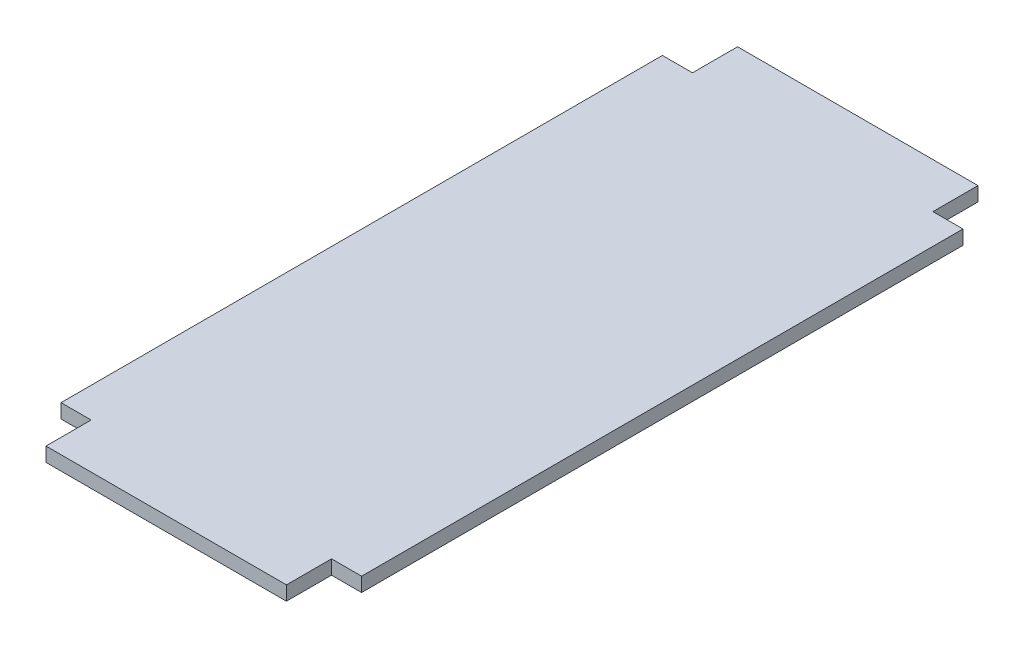
ISO-10303-21;
HEADER;
FILE_DESCRIPTION(('STEP AP214'),'2;1');
FILE_NAME('part.step','',(''),(''),'','','');
FILE_SCHEMA(('AUTOMOTIVE_DESIGN { 1 0 10303 214 1 1 1 1 }'));
ENDSEC;
DATA;
#1=APPLICATION_CONTEXT('core data for automotive mechanical design processes');
#2=APPLICATION_PROTOCOL_DEFINITION('international standard','automotive_design',2000,#1);
#3=PRODUCT_CONTEXT('',#1,'mechanical');
#4=PRODUCT('Part','Part','',(#3));
#5=PRODUCT_RELATED_PRODUCT_CATEGORY('part','',(#4));
#6=PRODUCT_DEFINITION_FORMATION('','',#4);
#7=PRODUCT_DEFINITION_CONTEXT('part definition',#1,'design');
#8=PRODUCT_DEFINITION('design','',#6,#7);
#9=PRODUCT_DEFINITION_SHAPE('','',#8);
#10=(LENGTH_UNIT() NAMED_UNIT(*) SI_UNIT(.MILLI.,.METRE.));
#11=(NAMED_UNIT(*) PLANE_ANGLE_UNIT() SI_UNIT($,.RADIAN.));
#12=(NAMED_UNIT(*) SI_UNIT($,.STERADIAN.) SOLID_ANGLE_UNIT());
#13=UNCERTAINTY_MEASURE_WITH_UNIT(LENGTH_MEASURE(1.E-05),#10,'distance_accuracy_value','');
#14=(GEOMETRIC_REPRESENTATION_CONTEXT(3) GLOBAL_UNCERTAINTY_ASSIGNED_CONTEXT((#13)) GLOBAL_UNIT_ASSIGNED_CONTEXT((#10,
#11,#12)) REPRESENTATION_CONTEXT('',''));
#15=CARTESIAN_POINT('',(0.,0.,0.));
#16=DIRECTION('',(0.,0.,1.));
#17=DIRECTION('',(1.,0.,0.));
#18=AXIS2_PLACEMENT_3D('',#15,#16,#17);
#19=CARTESIAN_POINT('',(25.3873000000001,2.9972,0.));
#20=DIRECTION('',(1.,0.,0.));
#21=DIRECTION('',(0.,0.,-1.));
#22=AXIS2_PLACEMENT_3D('',#19,#20,#21);
#23=PLANE('',#22);
#24=DIRECTION('',(0.,0.,1.));
#25=VECTOR('',#24,1.);
#26=CARTESIAN_POINT('',(25.3873000000001,0.,0.));
#27=LINE('',#26,#25);
#28=CARTESIAN_POINT('',(25.3873000000001,0.,-73.025));
#29=VERTEX_POINT('',#28);
#30=CARTESIAN_POINT('',(25.3873000000001,0.,-63.5));
#31=VERTEX_POINT('',#30);
#32=EDGE_CURVE('E155',#29,#31,#27,.T.);
#33=ORIENTED_EDGE('',*,*,#32,.F.);
#34=DIRECTION('',(0.,-1.,0.));
#35=VECTOR('',#34,1.);
#36=CARTESIAN_POINT('',(25.3873000000001,2.9972,-73.025));
#37=LINE('',#36,#35);
#38=CARTESIAN_POINT('',(25.3873000000001,2.9972,-73.025));
#39=VERTEX_POINT('',#38);
#40=EDGE_CURVE('E11',#39,#29,#37,.T.);
#41=ORIENTED_EDGE('',*,*,#40,.F.);
#42=DIRECTION('',(0.,0.,1.));
#43=VECTOR('',#42,1.);
#44=CARTESIAN_POINT('',(25.3873000000001,2.9972,0.));
#45=LINE('',#44,#43);
#46=CARTESIAN_POINT('',(25.3873000000001,2.9972,-63.5));
#47=VERTEX_POINT('',#46);
#48=EDGE_CURVE('E185',#39,#47,#45,.T.);
#49=ORIENTED_EDGE('',*,*,#48,.T.);
#50=DIRECTION('',(0.,-1.,0.));
#51=VECTOR('',#50,1.);
#52=CARTESIAN_POINT('',(25.3873000000001,2.9972,-63.5));
#53=LINE('',#52,#51);
#54=EDGE_CURVE('E98',#47,#31,#53,.T.);
#55=ORIENTED_EDGE('',*,*,#54,.T.);
#56=EDGE_LOOP('',(#33,#41,#49,#55));
#57=FACE_BOUND('',#56,.T.);
#58=ADVANCED_FACE('F36',(#57),#23,.T.);
#59=CARTESIAN_POINT('',(0.,2.9972,-73.025));
#60=DIRECTION('',(0.,0.,1.));
#61=DIRECTION('',(1.,0.,0.));
#62=AXIS2_PLACEMENT_3D('',#59,#60,#61);
#63=PLANE('',#62);
#64=DIRECTION('',(-1.,0.,0.));
#65=VECTOR('',#64,1.);
#66=CARTESIAN_POINT('',(0.,0.,-73.025));
#67=LINE('',#66,#65);
#68=CARTESIAN_POINT('',(-25.3872999999999,0.,-73.025));
#69=VERTEX_POINT('',#68);
#70=EDGE_CURVE('E158',#29,#69,#67,.T.);
#71=ORIENTED_EDGE('',*,*,#70,.T.);
#72=DIRECTION('',(0.,-1.,0.));
#73=VECTOR('',#72,1.);
#74=CARTESIAN_POINT('',(-25.3872999999999,2.9972,-73.025));
#75=LINE('',#74,#73);
#76=CARTESIAN_POINT('',(-25.3872999999999,2.9972,-73.025));
#77=VERTEX_POINT('',#76);
#78=EDGE_CURVE('E44',#77,#69,#75,.T.);
#79=ORIENTED_EDGE('',*,*,#78,.F.);
#80=DIRECTION('',(-1.,0.,0.));
#81=VECTOR('',#80,1.);
#82=CARTESIAN_POINT('',(0.,2.9972,-73.025));
#83=LINE('',#82,#81);
#84=EDGE_CURVE('E226',#39,#77,#83,.T.);
#85=ORIENTED_EDGE('',*,*,#84,.F.);
#86=ORIENTED_EDGE('',*,*,#40,.T.);
#87=EDGE_LOOP('',(#71,#79,#85,#86));
#88=FACE_BOUND('',#87,.T.);
#89=ADVANCED_FACE('F255',(#88),#63,.F.);
#90=CARTESIAN_POINT('',(-25.3872999999999,2.9972,0.));
#91=DIRECTION('',(1.,0.,0.));
#92=DIRECTION('',(0.,0.,-1.));
#93=AXIS2_PLACEMENT_3D('',#90,#91,#92);
#94=PLANE('',#93);
#95=DIRECTION('',(0.,0.,1.));
#96=VECTOR('',#95,1.);
#97=CARTESIAN_POINT('',(-25.3872999999999,0.,0.));
#98=LINE('',#97,#96);
#99=CARTESIAN_POINT('',(-25.3872999999999,0.,-63.5));
#100=VERTEX_POINT('',#99);
#101=EDGE_CURVE('E160',#69,#100,#98,.T.);
#102=ORIENTED_EDGE('',*,*,#101,.T.);
#103=DIRECTION('',(0.,-1.,0.));
#104=VECTOR('',#103,1.);
#105=CARTESIAN_POINT('',(-25.3872999999999,2.9972,-63.5));
#106=LINE('',#105,#104);
#107=CARTESIAN_POINT('',(-25.3872999999999,2.9972,-63.5));
#108=VERTEX_POINT('',#107);
#109=EDGE_CURVE('E199',#108,#100,#106,.T.);
#110=ORIENTED_EDGE('',*,*,#109,.F.);
#111=DIRECTION('',(0.,0.,1.));
#112=VECTOR('',#111,1.);
#113=CARTESIAN_POINT('',(-25.3872999999999,2.9972,0.));
#114=LINE('',#113,#112);
#115=EDGE_CURVE('E207',#77,#108,#114,.T.);
#116=ORIENTED_EDGE('',*,*,#115,.F.);
#117=ORIENTED_EDGE('',*,*,#78,.T.);
#118=EDGE_LOOP('',(#102,#110,#116,#117));
#119=FACE_BOUND('',#118,.T.);
#120=ADVANCED_FACE('F205',(#119),#94,.F.);
#121=CARTESIAN_POINT('',(0.,2.9972,-63.5));
#122=DIRECTION('',(0.,0.,-1.));
#123=DIRECTION('',(-1.,0.,0.));
#124=AXIS2_PLACEMENT_3D('',#121,#122,#123);
#125=PLANE('',#124);
#126=DIRECTION('',(1.,0.,0.));
#127=VECTOR('',#126,1.);
#128=CARTESIAN_POINT('',(0.,0.,-63.5));
#129=LINE('',#128,#127);
#130=CARTESIAN_POINT('',(-31.7372999999999,0.,-63.5));
#131=VERTEX_POINT('',#130);
#132=EDGE_CURVE('E163',#131,#100,#129,.T.);
#133=ORIENTED_EDGE('',*,*,#132,.F.);
#134=DIRECTION('',(0.,-1.,0.));
#135=VECTOR('',#134,1.);
#136=CARTESIAN_POINT('',(-31.7372999999999,2.9972,-63.5));
#137=LINE('',#136,#135);
#138=CARTESIAN_POINT('',(-31.7372999999999,2.9972,-63.5));
#139=VERTEX_POINT('',#138);
#140=EDGE_CURVE('E197',#139,#131,#137,.T.);
#141=ORIENTED_EDGE('',*,*,#140,.F.);
#142=DIRECTION('',(1.,0.,0.));
#143=VECTOR('',#142,1.);
#144=CARTESIAN_POINT('',(0.,2.9972,-63.5));
#145=LINE('',#144,#143);
#146=EDGE_CURVE('E219',#139,#108,#145,.T.);
#147=ORIENTED_EDGE('',*,*,#146,.T.);
#148=ORIENTED_EDGE('',*,*,#109,.T.);
#149=EDGE_LOOP('',(#133,#141,#147,#148));
#150=FACE_BOUND('',#149,.T.);
#151=ADVANCED_FACE('F216',(#150),#125,.T.);
#152=CARTESIAN_POINT('',(-31.7372999999999,2.9972,0.));
#153=DIRECTION('',(-1.,0.,0.));
#154=DIRECTION('',(0.,0.,1.));
#155=AXIS2_PLACEMENT_3D('',#152,#153,#154);
#156=PLANE('',#155);
#157=DIRECTION('',(0.,0.,-1.));
#158=VECTOR('',#157,1.);
#159=CARTESIAN_POINT('',(-31.7372999999999,0.,0.));
#160=LINE('',#159,#158);
#161=CARTESIAN_POINT('',(-31.7372999999999,0.,63.5));
#162=VERTEX_POINT('',#161);
#163=EDGE_CURVE('E166',#162,#131,#160,.T.);
#164=ORIENTED_EDGE('',*,*,#163,.F.);
#165=DIRECTION('',(0.,-1.,0.));
#166=VECTOR('',#165,1.);
#167=CARTESIAN_POINT('',(-31.7372999999999,2.9972,63.5));
#168=LINE('',#167,#166);
#169=CARTESIAN_POINT('',(-31.7372999999999,2.9972,63.5));
#170=VERTEX_POINT('',#169);
#171=EDGE_CURVE('E195',#170,#162,#168,.T.);
#172=ORIENTED_EDGE('',*,*,#171,.F.);
#173=DIRECTION('',(0.,0.,-1.));
#174=VECTOR('',#173,1.);
#175=CARTESIAN_POINT('',(-31.7372999999999,2.9972,0.));
#176=LINE('',#175,#174);
#177=EDGE_CURVE('E222',#170,#139,#176,.T.);
#178=ORIENTED_EDGE('',*,*,#177,.T.);
#179=ORIENTED_EDGE('',*,*,#140,.T.);
#180=EDGE_LOOP('',(#164,#172,#178,#179));
#181=FACE_BOUND('',#180,.T.);
#182=ADVANCED_FACE('F323',(#181),#156,.T.);
#183=CARTESIAN_POINT('',(0.,2.9972,63.5));
#184=DIRECTION('',(0.,0.,-1.));
#185=DIRECTION('',(-1.,0.,0.));
#186=AXIS2_PLACEMENT_3D('',#183,#184,#185);
#187=PLANE('',#186);
#188=DIRECTION('',(1.,0.,0.));
#189=VECTOR('',#188,1.);
#190=CARTESIAN_POINT('',(0.,0.,63.5));
#191=LINE('',#190,#189);
#192=CARTESIAN_POINT('',(-25.3872999999999,0.,63.5));
#193=VERTEX_POINT('',#192);
#194=EDGE_CURVE('E169',#162,#193,#191,.T.);
#195=ORIENTED_EDGE('',*,*,#194,.T.);
#196=DIRECTION('',(0.,-1.,0.));
#197=VECTOR('',#196,1.);
#198=CARTESIAN_POINT('',(-25.3872999999999,2.9972,63.5));
#199=LINE('',#198,#197);
#200=CARTESIAN_POINT('',(-25.3872999999999,2.9972,63.5));
#201=VERTEX_POINT('',#200);
#202=EDGE_CURVE('E193',#201,#193,#199,.T.);
#203=ORIENTED_EDGE('',*,*,#202,.F.);
#204=DIRECTION('',(1.,0.,0.));
#205=VECTOR('',#204,1.);
#206=CARTESIAN_POINT('',(0.,2.9972,63.5));
#207=LINE('',#206,#205);
#208=EDGE_CURVE('E224',#170,#201,#207,.T.);
#209=ORIENTED_EDGE('',*,*,#208,.F.);
#210=ORIENTED_EDGE('',*,*,#171,.T.);
#211=EDGE_LOOP('',(#195,#203,#209,#210));
#212=FACE_BOUND('',#211,.T.);
#213=ADVANCED_FACE('F314',(#212),#187,.F.);
#214=CARTESIAN_POINT('',(-25.3872999999999,2.9972,0.));
#215=DIRECTION('',(-1.,0.,0.));
#216=DIRECTION('',(0.,0.,1.));
#217=AXIS2_PLACEMENT_3D('',#214,#215,#216);
#218=PLANE('',#217);
#219=DIRECTION('',(0.,0.,-1.));
#220=VECTOR('',#219,1.);
#221=CARTESIAN_POINT('',(-25.3872999999999,0.,0.));
#222=LINE('',#221,#220);
#223=CARTESIAN_POINT('',(-25.3872999999999,0.,73.025));
#224=VERTEX_POINT('',#223);
#225=EDGE_CURVE('E172',#224,#193,#222,.T.);
#226=ORIENTED_EDGE('',*,*,#225,.F.);
#227=DIRECTION('',(0.,-1.,0.));
#228=VECTOR('',#227,1.);
#229=CARTESIAN_POINT('',(-25.3872999999999,2.9972,73.025));
#230=LINE('',#229,#228);
#231=CARTESIAN_POINT('',(-25.3872999999999,2.9972,73.025));
#232=VERTEX_POINT('',#231);
#233=EDGE_CURVE('E191',#232,#224,#230,.T.);
#234=ORIENTED_EDGE('',*,*,#233,.F.);
#235=DIRECTION('',(0.,0.,-1.));
#236=VECTOR('',#235,1.);
#237=CARTESIAN_POINT('',(-25.3872999999999,2.9972,0.));
#238=LINE('',#237,#236);
#239=EDGE_CURVE('E231',#232,#201,#238,.T.);
#240=ORIENTED_EDGE('',*,*,#239,.T.);
#241=ORIENTED_EDGE('',*,*,#202,.T.);
#242=EDGE_LOOP('',(#226,#234,#240,#241));
#243=FACE_BOUND('',#242,.T.);
#244=ADVANCED_FACE('F242',(#243),#218,.T.);
#245=CARTESIAN_POINT('',(0.,2.9972,73.025));
#246=DIRECTION('',(0.,0.,1.));
#247=DIRECTION('',(1.,0.,0.));
#248=AXIS2_PLACEMENT_3D('',#245,#246,#247);
#249=PLANE('',#248);
#250=DIRECTION('',(-1.,0.,0.));
#251=VECTOR('',#250,1.);
#252=CARTESIAN_POINT('',(0.,0.,73.025));
#253=LINE('',#252,#251);
#254=CARTESIAN_POINT('',(25.3873000000001,0.,73.025));
#255=VERTEX_POINT('',#254);
#256=EDGE_CURVE('E175',#255,#224,#253,.T.);
#257=ORIENTED_EDGE('',*,*,#256,.F.);
#258=DIRECTION('',(0.,-1.,0.));
#259=VECTOR('',#258,1.);
#260=CARTESIAN_POINT('',(25.3873000000001,2.9972,73.025));
#261=LINE('',#260,#259);
#262=CARTESIAN_POINT('',(25.3873000000001,2.9972,73.025));
#263=VERTEX_POINT('',#262);
#264=EDGE_CURVE('E189',#263,#255,#261,.T.);
#265=ORIENTED_EDGE('',*,*,#264,.F.);
#266=DIRECTION('',(-1.,0.,0.));
#267=VECTOR('',#266,1.);
#268=CARTESIAN_POINT('',(0.,2.9972,73.025));
#269=LINE('',#268,#267);
#270=EDGE_CURVE('E150',#263,#232,#269,.T.);
#271=ORIENTED_EDGE('',*,*,#270,.T.);
#272=ORIENTED_EDGE('',*,*,#233,.T.);
#273=EDGE_LOOP('',(#257,#265,#271,#272));
#274=FACE_BOUND('',#273,.T.);
#275=ADVANCED_FACE('F236',(#274),#249,.T.);
#276=CARTESIAN_POINT('',(25.3873000000001,2.9972,0.));
#277=DIRECTION('',(-1.,0.,0.));
#278=DIRECTION('',(0.,0.,1.));
#279=AXIS2_PLACEMENT_3D('',#276,#277,#278);
#280=PLANE('',#279);
#281=DIRECTION('',(0.,0.,-1.));
#282=VECTOR('',#281,1.);
#283=CARTESIAN_POINT('',(25.3873000000001,0.,0.));
#284=LINE('',#283,#282);
#285=CARTESIAN_POINT('',(25.3873000000001,0.,63.5));
#286=VERTEX_POINT('',#285);
#287=EDGE_CURVE('E178',#255,#286,#284,.T.);
#288=ORIENTED_EDGE('',*,*,#287,.T.);
#289=DIRECTION('',(0.,-1.,0.));
#290=VECTOR('',#289,1.);
#291=CARTESIAN_POINT('',(25.3873000000001,2.9972,63.5));
#292=LINE('',#291,#290);
#293=CARTESIAN_POINT('',(25.3873000000001,2.9972,63.5));
#294=VERTEX_POINT('',#293);
#295=EDGE_CURVE('E138',#294,#286,#292,.T.);
#296=ORIENTED_EDGE('',*,*,#295,.F.);
#297=DIRECTION('',(0.,0.,-1.));
#298=VECTOR('',#297,1.);
#299=CARTESIAN_POINT('',(25.3873000000001,2.9972,0.));
#300=LINE('',#299,#298);
#301=EDGE_CURVE('E147',#263,#294,#300,.T.);
#302=ORIENTED_EDGE('',*,*,#301,.F.);
#303=ORIENTED_EDGE('',*,*,#264,.T.);
#304=EDGE_LOOP('',(#288,#296,#302,#303));
#305=FACE_BOUND('',#304,.T.);
#306=ADVANCED_FACE('F245',(#305),#280,.F.);
#307=CARTESIAN_POINT('',(0.,2.9972,63.5));
#308=DIRECTION('',(0.,0.,1.));
#309=DIRECTION('',(1.,0.,0.));
#310=AXIS2_PLACEMENT_3D('',#307,#308,#309);
#311=PLANE('',#310);
#312=DIRECTION('',(-1.,0.,0.));
#313=VECTOR('',#312,1.);
#314=CARTESIAN_POINT('',(0.,0.,63.5));
#315=LINE('',#314,#313);
#316=CARTESIAN_POINT('',(31.7373000000001,0.,63.5));
#317=VERTEX_POINT('',#316);
#318=EDGE_CURVE('E137',#317,#286,#315,.T.);
#319=ORIENTED_EDGE('',*,*,#318,.F.);
#320=DIRECTION('',(0.,-1.,0.));
#321=VECTOR('',#320,1.);
#322=CARTESIAN_POINT('',(31.7373000000001,2.9972,63.5));
#323=LINE('',#322,#321);
#324=CARTESIAN_POINT('',(31.7373000000001,2.9972,63.5));
#325=VERTEX_POINT('',#324);
#326=EDGE_CURVE('E131',#325,#317,#323,.T.);
#327=ORIENTED_EDGE('',*,*,#326,.F.);
#328=DIRECTION('',(-1.,0.,0.));
#329=VECTOR('',#328,1.);
#330=CARTESIAN_POINT('',(0.,2.9972,63.5));
#331=LINE('',#330,#329);
#332=EDGE_CURVE('E135',#325,#294,#331,.T.);
#333=ORIENTED_EDGE('',*,*,#332,.T.);
#334=ORIENTED_EDGE('',*,*,#295,.T.);
#335=EDGE_LOOP('',(#319,#327,#333,#334));
#336=FACE_BOUND('',#335,.T.);
#337=ADVANCED_FACE('F133',(#336),#311,.T.);
#338=CARTESIAN_POINT('',(31.7373000000001,2.9972,0.));
#339=DIRECTION('',(-1.,0.,0.));
#340=DIRECTION('',(0.,0.,1.));
#341=AXIS2_PLACEMENT_3D('',#338,#339,#340);
#342=PLANE('',#341);
#343=DIRECTION('',(0.,0.,-1.));
#344=VECTOR('',#343,1.);
#345=CARTESIAN_POINT('',(31.7373000000001,0.,0.));
#346=LINE('',#345,#344);
#347=CARTESIAN_POINT('',(31.7373000000001,0.,-63.5));
#348=VERTEX_POINT('',#347);
#349=EDGE_CURVE('E91',#317,#348,#346,.T.);
#350=ORIENTED_EDGE('',*,*,#349,.T.);
#351=DIRECTION('',(0.,-1.,0.));
#352=VECTOR('',#351,1.);
#353=CARTESIAN_POINT('',(31.7373000000001,2.9972,-63.5));
#354=LINE('',#353,#352);
#355=CARTESIAN_POINT('',(31.7373000000001,2.9972,-63.5));
#356=VERTEX_POINT('',#355);
#357=EDGE_CURVE('E139',#356,#348,#354,.T.);
#358=ORIENTED_EDGE('',*,*,#357,.F.);
#359=DIRECTION('',(0.,0.,-1.));
#360=VECTOR('',#359,1.);
#361=CARTESIAN_POINT('',(31.7373000000001,2.9972,0.));
#362=LINE('',#361,#360);
#363=EDGE_CURVE('E141',#325,#356,#362,.T.);
#364=ORIENTED_EDGE('',*,*,#363,.F.);
#365=ORIENTED_EDGE('',*,*,#326,.T.);
#366=EDGE_LOOP('',(#350,#358,#364,#365));
#367=FACE_BOUND('',#366,.T.);
#368=ADVANCED_FACE('F142',(#367),#342,.F.);
#369=CARTESIAN_POINT('',(0.,2.9972,-63.5));
#370=DIRECTION('',(0.,0.,1.));
#371=DIRECTION('',(1.,0.,0.));
#372=AXIS2_PLACEMENT_3D('',#369,#370,#371);
#373=PLANE('',#372);
#374=DIRECTION('',(-1.,0.,0.));
#375=VECTOR('',#374,1.);
#376=CARTESIAN_POINT('',(0.,0.,-63.5));
#377=LINE('',#376,#375);
#378=EDGE_CURVE('E183',#348,#31,#377,.T.);
#379=ORIENTED_EDGE('',*,*,#378,.T.);
#380=ORIENTED_EDGE('',*,*,#54,.F.);
#381=DIRECTION('',(-1.,0.,0.));
#382=VECTOR('',#381,1.);
#383=CARTESIAN_POINT('',(0.,2.9972,-63.5));
#384=LINE('',#383,#382);
#385=EDGE_CURVE('E52',#356,#47,#384,.T.);
#386=ORIENTED_EDGE('',*,*,#385,.F.);
#387=ORIENTED_EDGE('',*,*,#357,.T.);
#388=EDGE_LOOP('',(#379,#380,#386,#387));
#389=FACE_BOUND('',#388,.T.);
#390=ADVANCED_FACE('F261',(#389),#373,.F.);
#391=CARTESIAN_POINT('',(0.,2.9972,0.));
#392=DIRECTION('',(0.,1.,0.));
#393=DIRECTION('',(0.,0.,1.));
#394=AXIS2_PLACEMENT_3D('',#391,#392,#393);
#395=PLANE('',#394);
#396=ORIENTED_EDGE('',*,*,#48,.F.);
#397=ORIENTED_EDGE('',*,*,#84,.T.);
#398=ORIENTED_EDGE('',*,*,#115,.T.);
#399=ORIENTED_EDGE('',*,*,#146,.F.);
#400=ORIENTED_EDGE('',*,*,#177,.F.);
#401=ORIENTED_EDGE('',*,*,#208,.T.);
#402=ORIENTED_EDGE('',*,*,#239,.F.);
#403=ORIENTED_EDGE('',*,*,#270,.F.);
#404=ORIENTED_EDGE('',*,*,#301,.T.);
#405=ORIENTED_EDGE('',*,*,#332,.F.);
#406=ORIENTED_EDGE('',*,*,#363,.T.);
#407=ORIENTED_EDGE('',*,*,#385,.T.);
#408=EDGE_LOOP('',(#396,#397,#398,#399,#400,#401,#402,#403,#404,#405,#406,#407));
#409=FACE_BOUND('',#408,.T.);
#410=ADVANCED_FACE('F144',(#409),#395,.T.);
#411=CARTESIAN_POINT('',(0.,0.,0.));
#412=DIRECTION('',(0.,1.,0.));
#413=DIRECTION('',(0.,0.,1.));
#414=AXIS2_PLACEMENT_3D('',#411,#412,#413);
#415=PLANE('',#414);
#416=ORIENTED_EDGE('',*,*,#32,.T.);
#417=ORIENTED_EDGE('',*,*,#378,.F.);
#418=ORIENTED_EDGE('',*,*,#349,.F.);
#419=ORIENTED_EDGE('',*,*,#318,.T.);
#420=ORIENTED_EDGE('',*,*,#287,.F.);
#421=ORIENTED_EDGE('',*,*,#256,.T.);
#422=ORIENTED_EDGE('',*,*,#225,.T.);
#423=ORIENTED_EDGE('',*,*,#194,.F.);
#424=ORIENTED_EDGE('',*,*,#163,.T.);
#425=ORIENTED_EDGE('',*,*,#132,.T.);
#426=ORIENTED_EDGE('',*,*,#101,.F.);
#427=ORIENTED_EDGE('',*,*,#70,.F.);
#428=EDGE_LOOP('',(#416,#417,#418,#419,#420,#421,#422,#423,#424,#425,#426,#427));
#429=FACE_BOUND('',#428,.T.);
#430=ADVANCED_FACE('F211',(#429),#415,.F.);
#431=CLOSED_SHELL('',(#58,#89,#120,#151,#182,#213,#244,#275,#306,#337,#368,#390,#410,#430));
#432=MANIFOLD_SOLID_BREP('B2',#431);
#433=ADVANCED_BREP_SHAPE_REPRESENTATION('',(#18,#432),#14);
#434=SHAPE_DEFINITION_REPRESENTATION(#9,#433);
ENDSEC;
END-ISO-10303-21;
